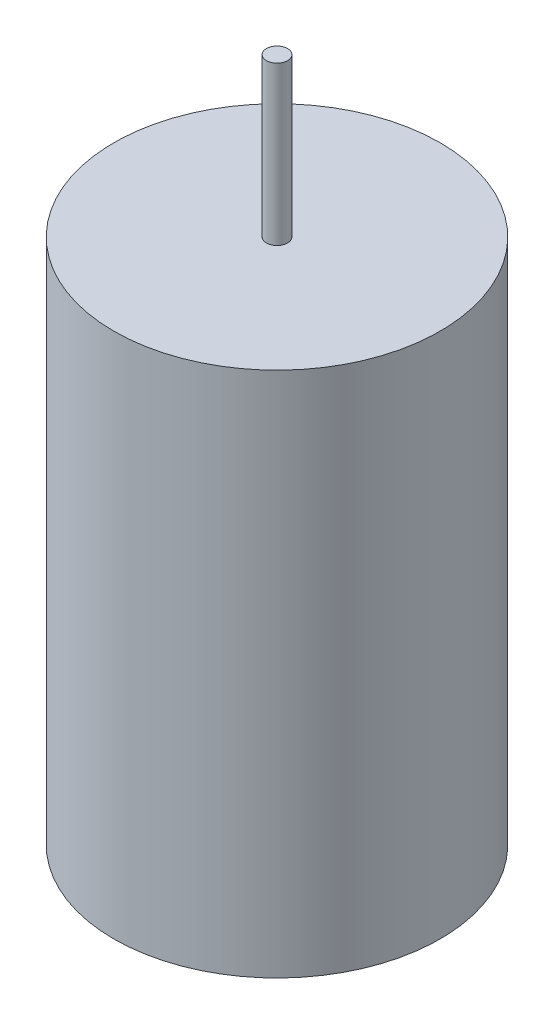
ISO-10303-21;
HEADER;
FILE_DESCRIPTION(('STEP AP214'),'2;1');
FILE_NAME('part.step','',(''),(''),'','','');
FILE_SCHEMA(('AUTOMOTIVE_DESIGN { 1 0 10303 214 1 1 1 1 }'));
ENDSEC;
DATA;
#1=APPLICATION_CONTEXT('core data for automotive mechanical design processes');
#2=APPLICATION_PROTOCOL_DEFINITION('international standard','automotive_design',2000,#1);
#3=PRODUCT_CONTEXT('',#1,'mechanical');
#4=PRODUCT('Part','Part','',(#3));
#5=PRODUCT_RELATED_PRODUCT_CATEGORY('part','',(#4));
#6=PRODUCT_DEFINITION_FORMATION('','',#4);
#7=PRODUCT_DEFINITION_CONTEXT('part definition',#1,'design');
#8=PRODUCT_DEFINITION('design','',#6,#7);
#9=PRODUCT_DEFINITION_SHAPE('','',#8);
#10=(LENGTH_UNIT() NAMED_UNIT(*) SI_UNIT(.MILLI.,.METRE.));
#11=(NAMED_UNIT(*) PLANE_ANGLE_UNIT() SI_UNIT($,.RADIAN.));
#12=(NAMED_UNIT(*) SI_UNIT($,.STERADIAN.) SOLID_ANGLE_UNIT());
#13=UNCERTAINTY_MEASURE_WITH_UNIT(LENGTH_MEASURE(1.E-05),#10,'distance_accuracy_value','');
#14=(GEOMETRIC_REPRESENTATION_CONTEXT(3) GLOBAL_UNCERTAINTY_ASSIGNED_CONTEXT((#13)) GLOBAL_UNIT_ASSIGNED_CONTEXT((#10,
#11,#12)) REPRESENTATION_CONTEXT('',''));
#15=CARTESIAN_POINT('',(0.,0.,0.));
#16=DIRECTION('',(0.,0.,1.));
#17=DIRECTION('',(1.,0.,0.));
#18=AXIS2_PLACEMENT_3D('',#15,#16,#17);
#19=CARTESIAN_POINT('',(0.,50.,0.));
#20=DIRECTION('',(0.,-1.,0.));
#21=DIRECTION('',(0.,0.,-1.));
#22=AXIS2_PLACEMENT_3D('',#19,#20,#21);
#23=CYLINDRICAL_SURFACE('',#22,15.5);
#24=CARTESIAN_POINT('',(0.,50.,0.));
#25=DIRECTION('',(0.,1.,0.));
#26=DIRECTION('',(0.,0.,1.));
#27=AXIS2_PLACEMENT_3D('',#24,#25,#26);
#28=CIRCLE('',#27,15.5);
#29=CARTESIAN_POINT('',(0.,50.,15.5));
#30=VERTEX_POINT('',#29);
#31=EDGE_CURVE('E10',#30,#30,#28,.T.);
#32=ORIENTED_EDGE('',*,*,#31,.F.);
#33=EDGE_LOOP('',(#32));
#34=FACE_BOUND('',#33,.T.);
#35=CARTESIAN_POINT('',(0.,0.,0.));
#36=DIRECTION('',(0.,1.,0.));
#37=DIRECTION('',(0.,0.,1.));
#38=AXIS2_PLACEMENT_3D('',#35,#36,#37);
#39=CIRCLE('',#38,15.5);
#40=CARTESIAN_POINT('',(0.,0.,15.5));
#41=VERTEX_POINT('',#40);
#42=EDGE_CURVE('E34',#41,#41,#39,.T.);
#43=ORIENTED_EDGE('',*,*,#42,.T.);
#44=EDGE_LOOP('',(#43));
#45=FACE_BOUND('',#44,.T.);
#46=ADVANCED_FACE('F31',(#34,#45),#23,.T.);
#47=CARTESIAN_POINT('',(0.,50.,0.));
#48=DIRECTION('',(0.,1.,0.));
#49=DIRECTION('',(0.,0.,1.));
#50=AXIS2_PLACEMENT_3D('',#47,#48,#49);
#51=PLANE('',#50);
#52=CARTESIAN_POINT('',(0.,50.,0.));
#53=DIRECTION('',(0.,1.,0.));
#54=DIRECTION('',(0.,0.,1.));
#55=AXIS2_PLACEMENT_3D('',#52,#53,#54);
#56=CIRCLE('',#55,1.);
#57=CARTESIAN_POINT('',(0.,50.,1.));
#58=VERTEX_POINT('',#57);
#59=EDGE_CURVE('E43',#58,#58,#56,.T.);
#60=ORIENTED_EDGE('',*,*,#59,.F.);
#61=EDGE_LOOP('',(#60));
#62=FACE_BOUND('',#61,.T.);
#63=ORIENTED_EDGE('',*,*,#31,.T.);
#64=EDGE_LOOP('',(#63));
#65=FACE_BOUND('',#64,.T.);
#66=ADVANCED_FACE('F58',(#62,#65),#51,.T.);
#67=CARTESIAN_POINT('',(0.,0.,0.));
#68=DIRECTION('',(0.,1.,0.));
#69=DIRECTION('',(0.,0.,1.));
#70=AXIS2_PLACEMENT_3D('',#67,#68,#69);
#71=PLANE('',#70);
#72=ORIENTED_EDGE('',*,*,#42,.F.);
#73=EDGE_LOOP('',(#72));
#74=FACE_BOUND('',#73,.T.);
#75=ADVANCED_FACE('F54',(#74),#71,.F.);
#76=CARTESIAN_POINT('',(0.,65.,0.));
#77=DIRECTION('',(0.,-1.,0.));
#78=DIRECTION('',(0.,0.,-1.));
#79=AXIS2_PLACEMENT_3D('',#76,#77,#78);
#80=CYLINDRICAL_SURFACE('',#79,1.);
#81=CARTESIAN_POINT('',(0.,65.,0.));
#82=DIRECTION('',(0.,1.,0.));
#83=DIRECTION('',(0.,0.,1.));
#84=AXIS2_PLACEMENT_3D('',#81,#82,#83);
#85=CIRCLE('',#84,1.);
#86=CARTESIAN_POINT('',(0.,65.,1.));
#87=VERTEX_POINT('',#86);
#88=EDGE_CURVE('E41',#87,#87,#85,.T.);
#89=ORIENTED_EDGE('',*,*,#88,.F.);
#90=EDGE_LOOP('',(#89));
#91=FACE_BOUND('',#90,.T.);
#92=ORIENTED_EDGE('',*,*,#59,.T.);
#93=EDGE_LOOP('',(#92));
#94=FACE_BOUND('',#93,.T.);
#95=ADVANCED_FACE('F51',(#91,#94),#80,.T.);
#96=CARTESIAN_POINT('',(0.,65.,0.));
#97=DIRECTION('',(0.,1.,0.));
#98=DIRECTION('',(0.,0.,1.));
#99=AXIS2_PLACEMENT_3D('',#96,#97,#98);
#100=PLANE('',#99);
#101=ORIENTED_EDGE('',*,*,#88,.T.);
#102=EDGE_LOOP('',(#101));
#103=FACE_BOUND('',#102,.T.);
#104=ADVANCED_FACE('F49',(#103),#100,.T.);
#105=CLOSED_SHELL('',(#46,#66,#75,#95,#104));
#106=MANIFOLD_SOLID_BREP('B2',#105);
#107=ADVANCED_BREP_SHAPE_REPRESENTATION('',(#18,#106),#14);
#108=SHAPE_DEFINITION_REPRESENTATION(#9,#107);
ENDSEC;
END-ISO-10303-21;
